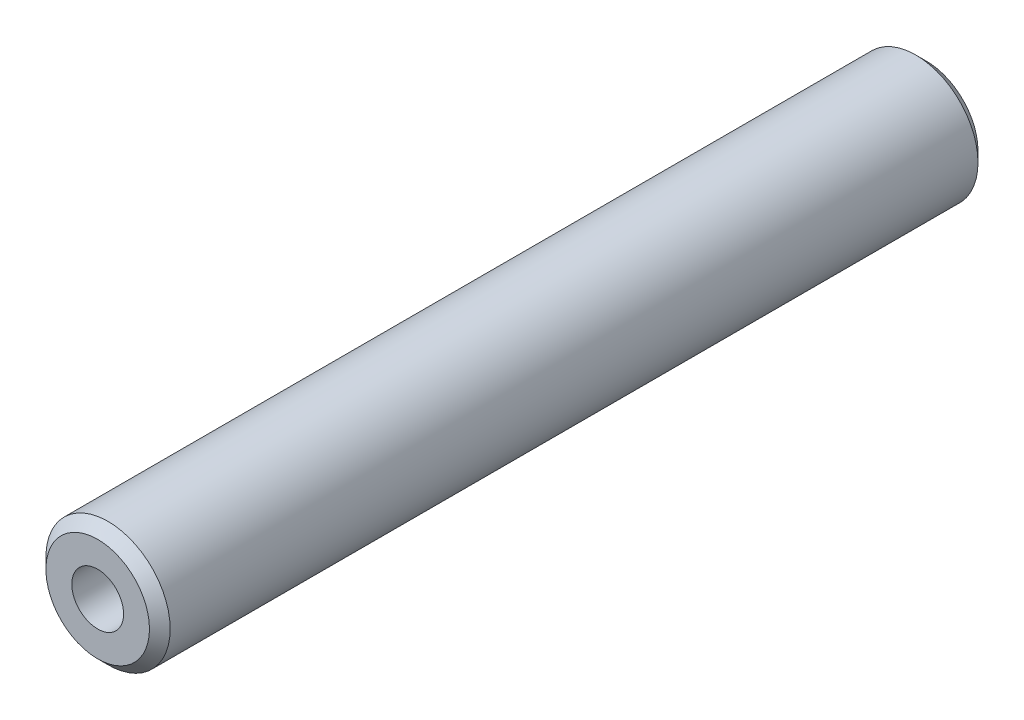
ISO-10303-21;
HEADER;
FILE_DESCRIPTION(('STEP AP214'),'2;1');
FILE_NAME('part.step','',(''),(''),'','','');
FILE_SCHEMA(('AUTOMOTIVE_DESIGN { 1 0 10303 214 1 1 1 1 }'));
ENDSEC;
DATA;
#1=APPLICATION_CONTEXT('core data for automotive mechanical design processes');
#2=APPLICATION_PROTOCOL_DEFINITION('international standard','automotive_design',2000,#1);
#3=PRODUCT_CONTEXT('',#1,'mechanical');
#4=PRODUCT('Part','Part','',(#3));
#5=PRODUCT_RELATED_PRODUCT_CATEGORY('part','',(#4));
#6=PRODUCT_DEFINITION_FORMATION('','',#4);
#7=PRODUCT_DEFINITION_CONTEXT('part definition',#1,'design');
#8=PRODUCT_DEFINITION('design','',#6,#7);
#9=PRODUCT_DEFINITION_SHAPE('','',#8);
#10=(LENGTH_UNIT() NAMED_UNIT(*) SI_UNIT(.MILLI.,.METRE.));
#11=(NAMED_UNIT(*) PLANE_ANGLE_UNIT() SI_UNIT($,.RADIAN.));
#12=(NAMED_UNIT(*) SI_UNIT($,.STERADIAN.) SOLID_ANGLE_UNIT());
#13=UNCERTAINTY_MEASURE_WITH_UNIT(LENGTH_MEASURE(1.E-05),#10,'distance_accuracy_value','');
#14=(GEOMETRIC_REPRESENTATION_CONTEXT(3) GLOBAL_UNCERTAINTY_ASSIGNED_CONTEXT((#13)) GLOBAL_UNIT_ASSIGNED_CONTEXT((#10,
#11,#12)) REPRESENTATION_CONTEXT('',''));
#15=CARTESIAN_POINT('',(0.,0.,0.));
#16=DIRECTION('',(0.,0.,1.));
#17=DIRECTION('',(1.,0.,0.));
#18=AXIS2_PLACEMENT_3D('',#15,#16,#17);
#19=CARTESIAN_POINT('',(0.,0.,20.));
#20=DIRECTION('',(0.,0.,-1.));
#21=DIRECTION('',(-1.,0.,0.));
#22=AXIS2_PLACEMENT_3D('',#19,#20,#21);
#23=CYLINDRICAL_SURFACE('',#22,3.);
#24=CARTESIAN_POINT('',(0.,0.,-19.5));
#25=DIRECTION('',(0.,0.,1.));
#26=DIRECTION('',(1.,0.,0.));
#27=AXIS2_PLACEMENT_3D('',#24,#25,#26);
#28=CIRCLE('',#27,3.);
#29=CARTESIAN_POINT('',(3.,0.,-19.5));
#30=VERTEX_POINT('',#29);
#31=EDGE_CURVE('E82',#30,#30,#28,.T.);
#32=ORIENTED_EDGE('',*,*,#31,.T.);
#33=EDGE_LOOP('',(#32));
#34=FACE_BOUND('',#33,.T.);
#35=CARTESIAN_POINT('',(0.,0.,19.5));
#36=DIRECTION('',(0.,0.,1.));
#37=DIRECTION('',(1.,0.,0.));
#38=AXIS2_PLACEMENT_3D('',#35,#36,#37);
#39=CIRCLE('',#38,3.);
#40=CARTESIAN_POINT('',(3.,0.,19.5));
#41=VERTEX_POINT('',#40);
#42=EDGE_CURVE('E79',#41,#41,#39,.F.);
#43=ORIENTED_EDGE('',*,*,#42,.T.);
#44=EDGE_LOOP('',(#43));
#45=FACE_BOUND('',#44,.T.);
#46=ADVANCED_FACE('F44',(#34,#45),#23,.T.);
#47=CARTESIAN_POINT('',(0.,0.,20.));
#48=DIRECTION('',(0.,0.,1.));
#49=DIRECTION('',(1.,0.,0.));
#50=AXIS2_PLACEMENT_3D('',#47,#48,#49);
#51=PLANE('',#50);
#52=CARTESIAN_POINT('',(0.,0.,20.));
#53=DIRECTION('',(0.,0.,1.));
#54=DIRECTION('',(1.,0.,0.));
#55=AXIS2_PLACEMENT_3D('',#52,#53,#54);
#56=CIRCLE('',#55,2.50000000000001);
#57=CARTESIAN_POINT('',(2.50000000000001,0.,20.));
#58=VERTEX_POINT('',#57);
#59=EDGE_CURVE('E11',#58,#58,#56,.T.);
#60=ORIENTED_EDGE('',*,*,#59,.T.);
#61=EDGE_LOOP('',(#60));
#62=FACE_BOUND('',#61,.T.);
#63=CARTESIAN_POINT('',(0.,0.,20.));
#64=DIRECTION('',(0.,0.,1.));
#65=DIRECTION('',(1.,0.,0.));
#66=AXIS2_PLACEMENT_3D('',#63,#64,#65);
#67=CIRCLE('',#66,1.24999999999999);
#68=CARTESIAN_POINT('',(1.24999999999999,0.,20.));
#69=VERTEX_POINT('',#68);
#70=EDGE_CURVE('E68',#69,#69,#67,.T.);
#71=ORIENTED_EDGE('',*,*,#70,.F.);
#72=EDGE_LOOP('',(#71));
#73=FACE_BOUND('',#72,.T.);
#74=ADVANCED_FACE('F97',(#62,#73),#51,.T.);
#75=CARTESIAN_POINT('',(0.,0.,-20.));
#76=DIRECTION('',(0.,0.,1.));
#77=DIRECTION('',(1.,0.,0.));
#78=AXIS2_PLACEMENT_3D('',#75,#76,#77);
#79=PLANE('',#78);
#80=CARTESIAN_POINT('',(0.,0.,-20.));
#81=DIRECTION('',(0.,0.,1.));
#82=DIRECTION('',(1.,0.,0.));
#83=AXIS2_PLACEMENT_3D('',#80,#81,#82);
#84=CIRCLE('',#83,2.5);
#85=CARTESIAN_POINT('',(2.5,0.,-20.));
#86=VERTEX_POINT('',#85);
#87=EDGE_CURVE('E52',#86,#86,#84,.F.);
#88=ORIENTED_EDGE('',*,*,#87,.T.);
#89=EDGE_LOOP('',(#88));
#90=FACE_BOUND('',#89,.T.);
#91=CARTESIAN_POINT('',(0.,0.,-20.));
#92=DIRECTION('',(0.,0.,-1.));
#93=DIRECTION('',(-1.,0.,0.));
#94=AXIS2_PLACEMENT_3D('',#91,#92,#93);
#95=CIRCLE('',#94,1.24999999999999);
#96=CARTESIAN_POINT('',(-1.24999999999999,0.,-20.));
#97=VERTEX_POINT('',#96);
#98=EDGE_CURVE('E69',#97,#97,#95,.T.);
#99=ORIENTED_EDGE('',*,*,#98,.F.);
#100=EDGE_LOOP('',(#99));
#101=FACE_BOUND('',#100,.T.);
#102=ADVANCED_FACE('F87',(#90,#101),#79,.F.);
#103=CARTESIAN_POINT('',(0.,0.,11.5));
#104=DIRECTION('',(0.,0.,1.));
#105=DIRECTION('',(1.,0.,0.));
#106=AXIS2_PLACEMENT_3D('',#103,#104,#105);
#107=CONICAL_SURFACE('',#106,1.24999999999999,1.02974425867665);
#108=CARTESIAN_POINT('',(0.,0.,10.7489242262155));
#109=VERTEX_POINT('',#108);
#110=VERTEX_LOOP('',#109);
#111=FACE_BOUND('',#110,.T.);
#112=CARTESIAN_POINT('',(0.,0.,11.5));
#113=DIRECTION('',(0.,0.,1.));
#114=DIRECTION('',(1.,0.,0.));
#115=AXIS2_PLACEMENT_3D('',#112,#113,#114);
#116=CIRCLE('',#115,1.24999999999999);
#117=CARTESIAN_POINT('',(1.24999999999999,0.,11.5));
#118=VERTEX_POINT('',#117);
#119=EDGE_CURVE('E72',#118,#118,#116,.T.);
#120=ORIENTED_EDGE('',*,*,#119,.T.);
#121=EDGE_LOOP('',(#120));
#122=FACE_BOUND('',#121,.T.);
#123=ADVANCED_FACE('F111',(#111,#122),#107,.F.);
#124=CARTESIAN_POINT('',(0.,0.,20.));
#125=DIRECTION('',(0.,0.,1.));
#126=DIRECTION('',(1.,0.,0.));
#127=AXIS2_PLACEMENT_3D('',#124,#125,#126);
#128=CYLINDRICAL_SURFACE('',#127,1.24999999999999);
#129=ORIENTED_EDGE('',*,*,#119,.F.);
#130=EDGE_LOOP('',(#129));
#131=FACE_BOUND('',#130,.T.);
#132=ORIENTED_EDGE('',*,*,#70,.T.);
#133=EDGE_LOOP('',(#132));
#134=FACE_BOUND('',#133,.T.);
#135=ADVANCED_FACE('F62',(#131,#134),#128,.F.);
#136=CARTESIAN_POINT('',(0.,0.,-11.5));
#137=DIRECTION('',(0.,0.,-1.));
#138=DIRECTION('',(-1.,0.,0.));
#139=AXIS2_PLACEMENT_3D('',#136,#137,#138);
#140=CONICAL_SURFACE('',#139,1.24999999999999,1.02974425867665);
#141=CARTESIAN_POINT('',(0.,0.,-10.7489242262155));
#142=VERTEX_POINT('',#141);
#143=VERTEX_LOOP('',#142);
#144=FACE_BOUND('',#143,.T.);
#145=CARTESIAN_POINT('',(0.,0.,-11.5));
#146=DIRECTION('',(0.,0.,-1.));
#147=DIRECTION('',(-1.,0.,0.));
#148=AXIS2_PLACEMENT_3D('',#145,#146,#147);
#149=CIRCLE('',#148,1.24999999999999);
#150=CARTESIAN_POINT('',(-1.24999999999999,0.,-11.5));
#151=VERTEX_POINT('',#150);
#152=EDGE_CURVE('E66',#151,#151,#149,.T.);
#153=ORIENTED_EDGE('',*,*,#152,.T.);
#154=EDGE_LOOP('',(#153));
#155=FACE_BOUND('',#154,.T.);
#156=ADVANCED_FACE('F58',(#144,#155),#140,.F.);
#157=CARTESIAN_POINT('',(0.,0.,-20.));
#158=DIRECTION('',(0.,0.,-1.));
#159=DIRECTION('',(-1.,0.,0.));
#160=AXIS2_PLACEMENT_3D('',#157,#158,#159);
#161=CYLINDRICAL_SURFACE('',#160,1.24999999999999);
#162=ORIENTED_EDGE('',*,*,#152,.F.);
#163=EDGE_LOOP('',(#162));
#164=FACE_BOUND('',#163,.T.);
#165=ORIENTED_EDGE('',*,*,#98,.T.);
#166=EDGE_LOOP('',(#165));
#167=FACE_BOUND('',#166,.T.);
#168=ADVANCED_FACE('F61',(#164,#167),#161,.F.);
#169=CARTESIAN_POINT('',(0.,0.,-19.5));
#170=DIRECTION('',(0.,0.,1.));
#171=DIRECTION('',(1.,0.,0.));
#172=AXIS2_PLACEMENT_3D('',#169,#170,#171);
#173=CONICAL_SURFACE('',#172,3.,0.785398163397453);
#174=ORIENTED_EDGE('',*,*,#87,.F.);
#175=EDGE_LOOP('',(#174));
#176=FACE_BOUND('',#175,.T.);
#177=ORIENTED_EDGE('',*,*,#31,.F.);
#178=EDGE_LOOP('',(#177));
#179=FACE_BOUND('',#178,.T.);
#180=ADVANCED_FACE('F90',(#176,#179),#173,.T.);
#181=CARTESIAN_POINT('',(0.,0.,20.));
#182=DIRECTION('',(0.,0.,-1.));
#183=DIRECTION('',(-1.,0.,0.));
#184=AXIS2_PLACEMENT_3D('',#181,#182,#183);
#185=CONICAL_SURFACE('',#184,2.50000000000001,0.785398163397439);
#186=ORIENTED_EDGE('',*,*,#42,.F.);
#187=EDGE_LOOP('',(#186));
#188=FACE_BOUND('',#187,.T.);
#189=ORIENTED_EDGE('',*,*,#59,.F.);
#190=EDGE_LOOP('',(#189));
#191=FACE_BOUND('',#190,.T.);
#192=ADVANCED_FACE('F46',(#188,#191),#185,.T.);
#193=CLOSED_SHELL('',(#46,#74,#102,#123,#135,#156,#168,#180,#192));
#194=MANIFOLD_SOLID_BREP('B2',#193);
#195=ADVANCED_BREP_SHAPE_REPRESENTATION('',(#18,#194),#14);
#196=SHAPE_DEFINITION_REPRESENTATION(#9,#195);
ENDSEC;
END-ISO-10303-21;
